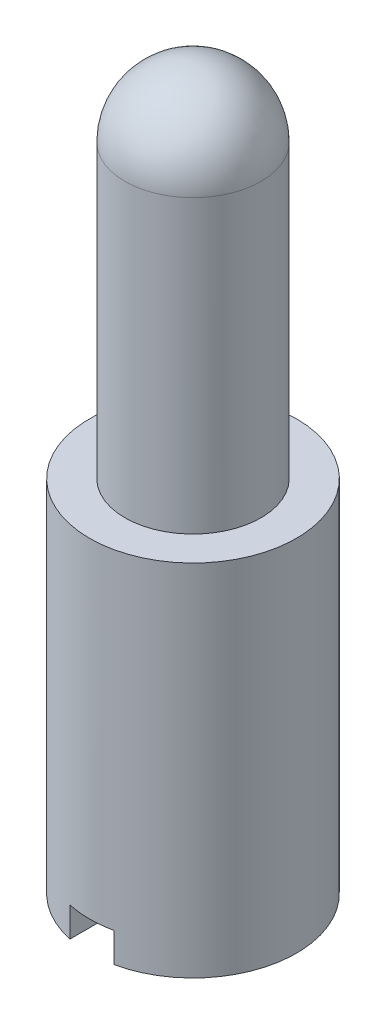
ISO-10303-21;
HEADER;
FILE_DESCRIPTION(('STEP AP214'),'2;1');
FILE_NAME('part.step','',(''),(''),'','','');
FILE_SCHEMA(('AUTOMOTIVE_DESIGN { 1 0 10303 214 1 1 1 1 }'));
ENDSEC;
DATA;
#1=APPLICATION_CONTEXT('core data for automotive mechanical design processes');
#2=APPLICATION_PROTOCOL_DEFINITION('international standard','automotive_design',2000,#1);
#3=PRODUCT_CONTEXT('',#1,'mechanical');
#4=PRODUCT('Part','Part','',(#3));
#5=PRODUCT_RELATED_PRODUCT_CATEGORY('part','',(#4));
#6=PRODUCT_DEFINITION_FORMATION('','',#4);
#7=PRODUCT_DEFINITION_CONTEXT('part definition',#1,'design');
#8=PRODUCT_DEFINITION('design','',#6,#7);
#9=PRODUCT_DEFINITION_SHAPE('','',#8);
#10=(LENGTH_UNIT() NAMED_UNIT(*) SI_UNIT(.MILLI.,.METRE.));
#11=(NAMED_UNIT(*) PLANE_ANGLE_UNIT() SI_UNIT($,.RADIAN.));
#12=(NAMED_UNIT(*) SI_UNIT($,.STERADIAN.) SOLID_ANGLE_UNIT());
#13=UNCERTAINTY_MEASURE_WITH_UNIT(LENGTH_MEASURE(1.E-05),#10,'distance_accuracy_value','');
#14=(GEOMETRIC_REPRESENTATION_CONTEXT(3) GLOBAL_UNCERTAINTY_ASSIGNED_CONTEXT((#13)) GLOBAL_UNIT_ASSIGNED_CONTEXT((#10,
#11,#12)) REPRESENTATION_CONTEXT('',''));
#15=CARTESIAN_POINT('',(0.,0.,0.));
#16=DIRECTION('',(0.,0.,1.));
#17=DIRECTION('',(1.,0.,0.));
#18=AXIS2_PLACEMENT_3D('',#15,#16,#17);
#19=CARTESIAN_POINT('',(0.,0.,0.));
#20=DIRECTION('',(0.,1.,0.));
#21=DIRECTION('',(0.,0.,1.));
#22=AXIS2_PLACEMENT_3D('',#19,#20,#21);
#23=PLANE('',#22);
#24=CARTESIAN_POINT('',(0.,0.,0.));
#25=DIRECTION('',(0.,1.,0.));
#26=DIRECTION('',(0.,0.,1.));
#27=AXIS2_PLACEMENT_3D('',#24,#25,#26);
#28=CIRCLE('',#27,2.7432);
#29=CARTESIAN_POINT('',(-0.5842,0.,-2.68027173995474));
#30=VERTEX_POINT('',#29);
#31=CARTESIAN_POINT('',(-0.5842,0.,2.68027173995474));
#32=VERTEX_POINT('',#31);
#33=EDGE_CURVE('E100',#30,#32,#28,.T.);
#34=ORIENTED_EDGE('',*,*,#33,.F.);
#35=DIRECTION('',(0.,0.,1.));
#36=VECTOR('',#35,1.);
#37=CARTESIAN_POINT('',(-0.5842,0.,-2.7432));
#38=LINE('',#37,#36);
#39=EDGE_CURVE('E97',#30,#32,#38,.T.);
#40=ORIENTED_EDGE('',*,*,#39,.T.);
#41=EDGE_LOOP('',(#34,#40));
#42=FACE_BOUND('',#41,.T.);
#43=ADVANCED_FACE('F47',(#42),#23,.F.);
#44=CARTESIAN_POINT('',(0.,17.2466,0.));
#45=DIRECTION('',(0.,1.,0.));
#46=DIRECTION('',(1.,0.,0.));
#47=AXIS2_PLACEMENT_3D('',#44,#45,#46);
#48=SPHERICAL_SURFACE('',#47,1.8034);
#49=CARTESIAN_POINT('',(0.,17.2466,0.));
#50=DIRECTION('',(0.,1.,0.));
#51=DIRECTION('',(0.,0.,1.));
#52=AXIS2_PLACEMENT_3D('',#49,#50,#51);
#53=CIRCLE('',#52,1.8034);
#54=CARTESIAN_POINT('',(0.,17.2466,1.8034));
#55=VERTEX_POINT('',#54);
#56=EDGE_CURVE('E118',#55,#55,#53,.T.);
#57=ORIENTED_EDGE('',*,*,#56,.T.);
#58=EDGE_LOOP('',(#57));
#59=FACE_BOUND('',#58,.T.);
#60=ADVANCED_FACE('F49',(#59),#48,.T.);
#61=CARTESIAN_POINT('',(0.5842,0.,2.68027173995474));
#62=VERTEX_POINT('',#61);
#63=CARTESIAN_POINT('',(0.5842,0.,-2.68027173995474));
#64=VERTEX_POINT('',#63);
#65=EDGE_CURVE('E96',#62,#64,#28,.T.);
#66=ORIENTED_EDGE('',*,*,#65,.F.);
#67=DIRECTION('',(0.,0.,1.));
#68=VECTOR('',#67,1.);
#69=CARTESIAN_POINT('',(0.5842,0.,-2.7432));
#70=LINE('',#69,#68);
#71=EDGE_CURVE('E62',#64,#62,#70,.T.);
#72=ORIENTED_EDGE('',*,*,#71,.F.);
#73=EDGE_LOOP('',(#66,#72));
#74=FACE_BOUND('',#73,.T.);
#75=ADVANCED_FACE('F95',(#74),#23,.F.);
#76=CARTESIAN_POINT('',(0.,19.05,0.));
#77=DIRECTION('',(0.,1.,0.));
#78=DIRECTION('',(0.,0.,1.));
#79=AXIS2_PLACEMENT_3D('',#76,#77,#78);
#80=CYLINDRICAL_SURFACE('',#79,2.7432);
#81=CARTESIAN_POINT('',(0.,9.525,0.));
#82=DIRECTION('',(0.,1.,0.));
#83=DIRECTION('',(0.,0.,1.));
#84=AXIS2_PLACEMENT_3D('',#81,#82,#83);
#85=CIRCLE('',#84,2.7432);
#86=CARTESIAN_POINT('',(0.,9.525,2.7432));
#87=VERTEX_POINT('',#86);
#88=EDGE_CURVE('E106',#87,#87,#85,.T.);
#89=ORIENTED_EDGE('',*,*,#88,.F.);
#90=EDGE_LOOP('',(#89));
#91=FACE_BOUND('',#90,.T.);
#92=DIRECTION('',(0.,1.,0.));
#93=VECTOR('',#92,1.);
#94=CARTESIAN_POINT('',(0.5842,19.05,-2.68027173995474));
#95=LINE('',#94,#93);
#96=CARTESIAN_POINT('',(0.5842,0.7874,-2.68027173995474));
#97=VERTEX_POINT('',#96);
#98=EDGE_CURVE('E11',#64,#97,#95,.T.);
#99=ORIENTED_EDGE('',*,*,#98,.T.);
#100=CARTESIAN_POINT('',(0.,0.787400000000001,0.));
#101=DIRECTION('',(0.,1.,0.));
#102=DIRECTION('',(0.,0.,1.));
#103=AXIS2_PLACEMENT_3D('',#100,#101,#102);
#104=CIRCLE('',#103,2.7432);
#105=CARTESIAN_POINT('',(-0.5842,0.787400000000001,-2.68027173995474));
#106=VERTEX_POINT('',#105);
#107=EDGE_CURVE('E104',#97,#106,#104,.T.);
#108=ORIENTED_EDGE('',*,*,#107,.T.);
#109=DIRECTION('',(0.,1.,0.));
#110=VECTOR('',#109,1.);
#111=CARTESIAN_POINT('',(-0.5842,19.05,-2.68027173995474));
#112=LINE('',#111,#110);
#113=EDGE_CURVE('E112',#106,#30,#112,.F.);
#114=ORIENTED_EDGE('',*,*,#113,.T.);
#115=ORIENTED_EDGE('',*,*,#33,.T.);
#116=DIRECTION('',(0.,1.,0.));
#117=VECTOR('',#116,1.);
#118=CARTESIAN_POINT('',(-0.5842,19.05,2.68027173995474));
#119=LINE('',#118,#117);
#120=CARTESIAN_POINT('',(-0.5842,0.787400000000001,2.68027173995474));
#121=VERTEX_POINT('',#120);
#122=EDGE_CURVE('E102',#32,#121,#119,.T.);
#123=ORIENTED_EDGE('',*,*,#122,.T.);
#124=CARTESIAN_POINT('',(0.5842,0.7874,2.68027173995474));
#125=VERTEX_POINT('',#124);
#126=EDGE_CURVE('E70',#121,#125,#104,.T.);
#127=ORIENTED_EDGE('',*,*,#126,.T.);
#128=DIRECTION('',(0.,1.,0.));
#129=VECTOR('',#128,1.);
#130=CARTESIAN_POINT('',(0.5842,19.05,2.68027173995474));
#131=LINE('',#130,#129);
#132=EDGE_CURVE('E55',#125,#62,#131,.F.);
#133=ORIENTED_EDGE('',*,*,#132,.T.);
#134=ORIENTED_EDGE('',*,*,#65,.T.);
#135=EDGE_LOOP('',(#99,#108,#114,#115,#123,#127,#133,#134));
#136=FACE_BOUND('',#135,.T.);
#137=ADVANCED_FACE('F99',(#91,#136),#80,.T.);
#138=CARTESIAN_POINT('',(2.7432,9.525,0.));
#139=DIRECTION('',(0.,-1.,0.));
#140=DIRECTION('',(0.,0.,-1.));
#141=AXIS2_PLACEMENT_3D('',#138,#139,#140);
#142=PLANE('',#141);
#143=CARTESIAN_POINT('',(0.,9.525,0.));
#144=DIRECTION('',(0.,1.,0.));
#145=DIRECTION('',(0.,0.,1.));
#146=AXIS2_PLACEMENT_3D('',#143,#144,#145);
#147=CIRCLE('',#146,1.8034);
#148=CARTESIAN_POINT('',(0.,9.525,1.8034));
#149=VERTEX_POINT('',#148);
#150=EDGE_CURVE('E121',#149,#149,#147,.T.);
#151=ORIENTED_EDGE('',*,*,#150,.F.);
#152=EDGE_LOOP('',(#151));
#153=FACE_BOUND('',#152,.T.);
#154=ORIENTED_EDGE('',*,*,#88,.T.);
#155=EDGE_LOOP('',(#154));
#156=FACE_BOUND('',#155,.T.);
#157=ADVANCED_FACE('F132',(#153,#156),#142,.F.);
#158=CARTESIAN_POINT('',(0.,19.05,0.));
#159=DIRECTION('',(0.,1.,0.));
#160=DIRECTION('',(0.,0.,1.));
#161=AXIS2_PLACEMENT_3D('',#158,#159,#160);
#162=CYLINDRICAL_SURFACE('',#161,1.8034);
#163=ORIENTED_EDGE('',*,*,#56,.F.);
#164=EDGE_LOOP('',(#163));
#165=FACE_BOUND('',#164,.T.);
#166=ORIENTED_EDGE('',*,*,#150,.T.);
#167=EDGE_LOOP('',(#166));
#168=FACE_BOUND('',#167,.T.);
#169=ADVANCED_FACE('F139',(#165,#168),#162,.T.);
#170=CARTESIAN_POINT('',(-0.5842,0.,-2.7432));
#171=DIRECTION('',(-1.,0.,0.));
#172=DIRECTION('',(0.,0.,1.));
#173=AXIS2_PLACEMENT_3D('',#170,#171,#172);
#174=PLANE('',#173);
#175=ORIENTED_EDGE('',*,*,#39,.F.);
#176=ORIENTED_EDGE('',*,*,#113,.F.);
#177=DIRECTION('',(0.,0.,1.));
#178=VECTOR('',#177,1.);
#179=CARTESIAN_POINT('',(-0.5842,0.7874,-2.7432));
#180=LINE('',#179,#178);
#181=EDGE_CURVE('E116',#106,#121,#180,.T.);
#182=ORIENTED_EDGE('',*,*,#181,.T.);
#183=ORIENTED_EDGE('',*,*,#122,.F.);
#184=EDGE_LOOP('',(#175,#176,#182,#183));
#185=FACE_BOUND('',#184,.T.);
#186=ADVANCED_FACE('F150',(#185),#174,.F.);
#187=CARTESIAN_POINT('',(-0.5842,0.7874,-2.7432));
#188=DIRECTION('',(0.,1.,0.));
#189=DIRECTION('',(0.,0.,1.));
#190=AXIS2_PLACEMENT_3D('',#187,#188,#189);
#191=PLANE('',#190);
#192=DIRECTION('',(0.,0.,1.));
#193=VECTOR('',#192,1.);
#194=CARTESIAN_POINT('',(0.5842,0.7874,-2.7432));
#195=LINE('',#194,#193);
#196=EDGE_CURVE('E89',#97,#125,#195,.T.);
#197=ORIENTED_EDGE('',*,*,#196,.T.);
#198=ORIENTED_EDGE('',*,*,#126,.F.);
#199=ORIENTED_EDGE('',*,*,#181,.F.);
#200=ORIENTED_EDGE('',*,*,#107,.F.);
#201=EDGE_LOOP('',(#197,#198,#199,#200));
#202=FACE_BOUND('',#201,.T.);
#203=ADVANCED_FACE('F115',(#202),#191,.F.);
#204=CARTESIAN_POINT('',(0.5842,0.,-2.7432));
#205=DIRECTION('',(1.,0.,0.));
#206=DIRECTION('',(0.,0.,-1.));
#207=AXIS2_PLACEMENT_3D('',#204,#205,#206);
#208=PLANE('',#207);
#209=ORIENTED_EDGE('',*,*,#71,.T.);
#210=ORIENTED_EDGE('',*,*,#132,.F.);
#211=ORIENTED_EDGE('',*,*,#196,.F.);
#212=ORIENTED_EDGE('',*,*,#98,.F.);
#213=EDGE_LOOP('',(#209,#210,#211,#212));
#214=FACE_BOUND('',#213,.T.);
#215=ADVANCED_FACE('F88',(#214),#208,.F.);
#216=CLOSED_SHELL('',(#43,#60,#75,#137,#157,#169,#186,#203,#215));
#217=MANIFOLD_SOLID_BREP('B2',#216);
#218=ADVANCED_BREP_SHAPE_REPRESENTATION('',(#18,#217),#14);
#219=SHAPE_DEFINITION_REPRESENTATION(#9,#218);
ENDSEC;
END-ISO-10303-21;
